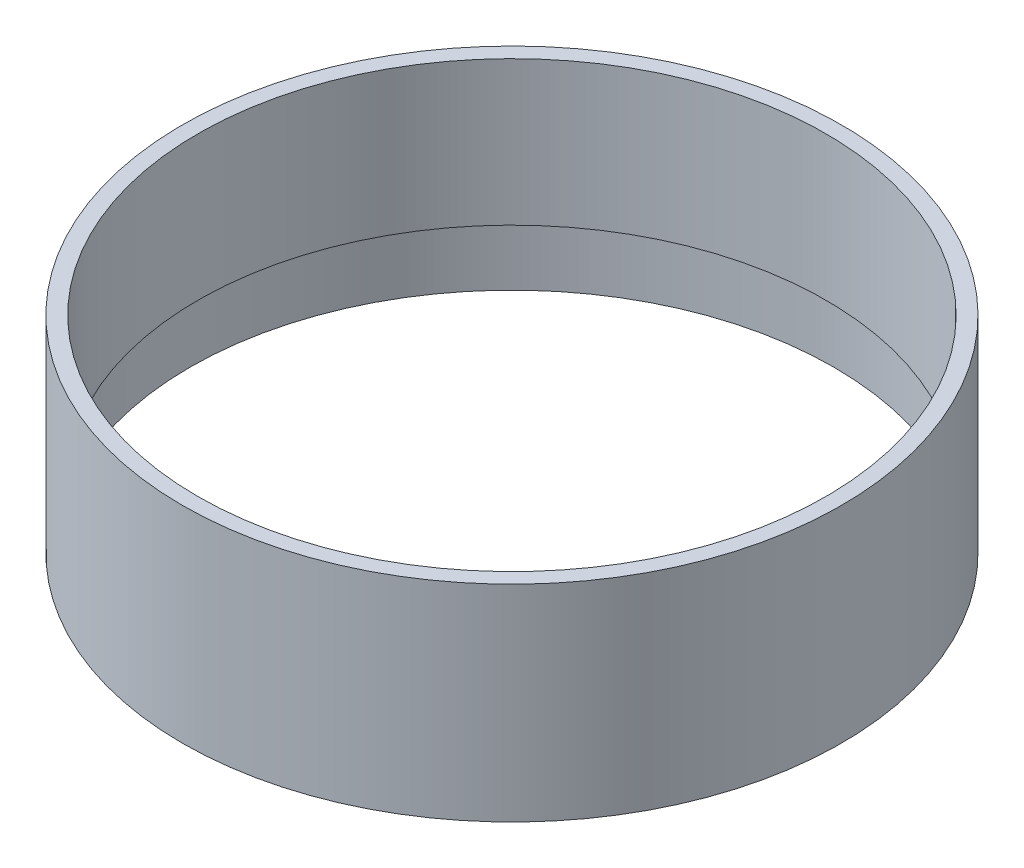
ISO-10303-21;
HEADER;
FILE_DESCRIPTION(('STEP AP214'),'2;1');
FILE_NAME('part.step','',(''),(''),'','','');
FILE_SCHEMA(('AUTOMOTIVE_DESIGN { 1 0 10303 214 1 1 1 1 }'));
ENDSEC;
DATA;
#1=APPLICATION_CONTEXT('core data for automotive mechanical design processes');
#2=APPLICATION_PROTOCOL_DEFINITION('international standard','automotive_design',2000,#1);
#3=PRODUCT_CONTEXT('',#1,'mechanical');
#4=PRODUCT('Part','Part','',(#3));
#5=PRODUCT_RELATED_PRODUCT_CATEGORY('part','',(#4));
#6=PRODUCT_DEFINITION_FORMATION('','',#4);
#7=PRODUCT_DEFINITION_CONTEXT('part definition',#1,'design');
#8=PRODUCT_DEFINITION('design','',#6,#7);
#9=PRODUCT_DEFINITION_SHAPE('','',#8);
#10=(LENGTH_UNIT() NAMED_UNIT(*) SI_UNIT(.MILLI.,.METRE.));
#11=(NAMED_UNIT(*) PLANE_ANGLE_UNIT() SI_UNIT($,.RADIAN.));
#12=(NAMED_UNIT(*) SI_UNIT($,.STERADIAN.) SOLID_ANGLE_UNIT());
#13=UNCERTAINTY_MEASURE_WITH_UNIT(LENGTH_MEASURE(1.E-05),#10,'distance_accuracy_value','');
#14=(GEOMETRIC_REPRESENTATION_CONTEXT(3) GLOBAL_UNCERTAINTY_ASSIGNED_CONTEXT((#13)) GLOBAL_UNIT_ASSIGNED_CONTEXT((#10,
#11,#12)) REPRESENTATION_CONTEXT('',''));
#15=CARTESIAN_POINT('',(0.,0.,0.));
#16=DIRECTION('',(0.,0.,1.));
#17=DIRECTION('',(1.,0.,0.));
#18=AXIS2_PLACEMENT_3D('',#15,#16,#17);
#19=CARTESIAN_POINT('',(0.,10.,0.));
#20=DIRECTION('',(0.,-1.,0.));
#21=DIRECTION('',(0.,0.,-1.));
#22=AXIS2_PLACEMENT_3D('',#19,#20,#21);
#23=CYLINDRICAL_SURFACE('',#22,16.);
#24=CARTESIAN_POINT('',(0.,10.,0.));
#25=DIRECTION('',(0.,1.,0.));
#26=DIRECTION('',(0.,0.,1.));
#27=AXIS2_PLACEMENT_3D('',#24,#25,#26);
#28=CIRCLE('',#27,16.);
#29=CARTESIAN_POINT('',(0.,10.,16.));
#30=VERTEX_POINT('',#29);
#31=EDGE_CURVE('E41',#30,#30,#28,.T.);
#32=ORIENTED_EDGE('',*,*,#31,.F.);
#33=EDGE_LOOP('',(#32));
#34=FACE_BOUND('',#33,.T.);
#35=CARTESIAN_POINT('',(0.,0.,0.));
#36=DIRECTION('',(0.,1.,0.));
#37=DIRECTION('',(0.,0.,1.));
#38=AXIS2_PLACEMENT_3D('',#35,#36,#37);
#39=CIRCLE('',#38,16.);
#40=CARTESIAN_POINT('',(0.,0.,16.));
#41=VERTEX_POINT('',#40);
#42=EDGE_CURVE('E46',#41,#41,#39,.T.);
#43=ORIENTED_EDGE('',*,*,#42,.T.);
#44=EDGE_LOOP('',(#43));
#45=FACE_BOUND('',#44,.T.);
#46=ADVANCED_FACE('F34',(#34,#45),#23,.T.);
#47=CARTESIAN_POINT('',(0.,10.,0.));
#48=DIRECTION('',(0.,-1.,0.));
#49=DIRECTION('',(0.,0.,-1.));
#50=AXIS2_PLACEMENT_3D('',#47,#48,#49);
#51=CYLINDRICAL_SURFACE('',#50,15.25);
#52=CARTESIAN_POINT('',(0.,3.,0.));
#53=DIRECTION('',(0.,1.,0.));
#54=DIRECTION('',(0.,0.,1.));
#55=AXIS2_PLACEMENT_3D('',#52,#53,#54);
#56=CIRCLE('',#55,15.25);
#57=CARTESIAN_POINT('',(0.,3.,15.25));
#58=VERTEX_POINT('',#57);
#59=EDGE_CURVE('E37',#58,#58,#56,.T.);
#60=ORIENTED_EDGE('',*,*,#59,.F.);
#61=EDGE_LOOP('',(#60));
#62=FACE_BOUND('',#61,.T.);
#63=CARTESIAN_POINT('',(0.,10.,0.));
#64=DIRECTION('',(0.,1.,0.));
#65=DIRECTION('',(0.,0.,1.));
#66=AXIS2_PLACEMENT_3D('',#63,#64,#65);
#67=CIRCLE('',#66,15.25);
#68=CARTESIAN_POINT('',(0.,10.,15.25));
#69=VERTEX_POINT('',#68);
#70=EDGE_CURVE('E10',#69,#69,#67,.T.);
#71=ORIENTED_EDGE('',*,*,#70,.T.);
#72=EDGE_LOOP('',(#71));
#73=FACE_BOUND('',#72,.T.);
#74=ADVANCED_FACE('F80',(#62,#73),#51,.F.);
#75=CARTESIAN_POINT('',(0.,10.,0.));
#76=DIRECTION('',(0.,1.,0.));
#77=DIRECTION('',(0.,0.,1.));
#78=AXIS2_PLACEMENT_3D('',#75,#76,#77);
#79=PLANE('',#78);
#80=ORIENTED_EDGE('',*,*,#31,.T.);
#81=EDGE_LOOP('',(#80));
#82=FACE_BOUND('',#81,.T.);
#83=ORIENTED_EDGE('',*,*,#70,.F.);
#84=EDGE_LOOP('',(#83));
#85=FACE_BOUND('',#84,.T.);
#86=ADVANCED_FACE('F76',(#82,#85),#79,.T.);
#87=CARTESIAN_POINT('',(0.,0.,0.));
#88=DIRECTION('',(0.,1.,0.));
#89=DIRECTION('',(0.,0.,1.));
#90=AXIS2_PLACEMENT_3D('',#87,#88,#89);
#91=PLANE('',#90);
#92=CARTESIAN_POINT('',(0.,0.,0.));
#93=DIRECTION('',(0.,1.,0.));
#94=DIRECTION('',(0.,0.,1.));
#95=AXIS2_PLACEMENT_3D('',#92,#93,#94);
#96=CIRCLE('',#95,15.625);
#97=CARTESIAN_POINT('',(0.,0.,15.625));
#98=VERTEX_POINT('',#97);
#99=EDGE_CURVE('E57',#98,#98,#96,.T.);
#100=ORIENTED_EDGE('',*,*,#99,.T.);
#101=EDGE_LOOP('',(#100));
#102=FACE_BOUND('',#101,.T.);
#103=ORIENTED_EDGE('',*,*,#42,.F.);
#104=EDGE_LOOP('',(#103));
#105=FACE_BOUND('',#104,.T.);
#106=ADVANCED_FACE('F64',(#102,#105),#91,.F.);
#107=CARTESIAN_POINT('',(0.,3.,0.));
#108=DIRECTION('',(0.,-1.,0.));
#109=DIRECTION('',(0.,0.,-1.));
#110=AXIS2_PLACEMENT_3D('',#107,#108,#109);
#111=CYLINDRICAL_SURFACE('',#110,15.625);
#112=CARTESIAN_POINT('',(0.,3.,0.));
#113=DIRECTION('',(0.,1.,0.));
#114=DIRECTION('',(0.,0.,1.));
#115=AXIS2_PLACEMENT_3D('',#112,#113,#114);
#116=CIRCLE('',#115,15.625);
#117=CARTESIAN_POINT('',(0.,3.,15.625));
#118=VERTEX_POINT('',#117);
#119=EDGE_CURVE('E53',#118,#118,#116,.T.);
#120=ORIENTED_EDGE('',*,*,#119,.T.);
#121=EDGE_LOOP('',(#120));
#122=FACE_BOUND('',#121,.T.);
#123=ORIENTED_EDGE('',*,*,#99,.F.);
#124=EDGE_LOOP('',(#123));
#125=FACE_BOUND('',#124,.T.);
#126=ADVANCED_FACE('F67',(#122,#125),#111,.F.);
#127=CARTESIAN_POINT('',(0.,3.,0.));
#128=DIRECTION('',(0.,1.,0.));
#129=DIRECTION('',(0.,0.,1.));
#130=AXIS2_PLACEMENT_3D('',#127,#128,#129);
#131=PLANE('',#130);
#132=ORIENTED_EDGE('',*,*,#59,.T.);
#133=EDGE_LOOP('',(#132));
#134=FACE_BOUND('',#133,.T.);
#135=ORIENTED_EDGE('',*,*,#119,.F.);
#136=EDGE_LOOP('',(#135));
#137=FACE_BOUND('',#136,.T.);
#138=ADVANCED_FACE('F69',(#134,#137),#131,.F.);
#139=CLOSED_SHELL('',(#46,#74,#86,#106,#126,#138));
#140=MANIFOLD_SOLID_BREP('B2',#139);
#141=ADVANCED_BREP_SHAPE_REPRESENTATION('',(#18,#140),#14);
#142=SHAPE_DEFINITION_REPRESENTATION(#9,#141);
ENDSEC;
END-ISO-10303-21;
